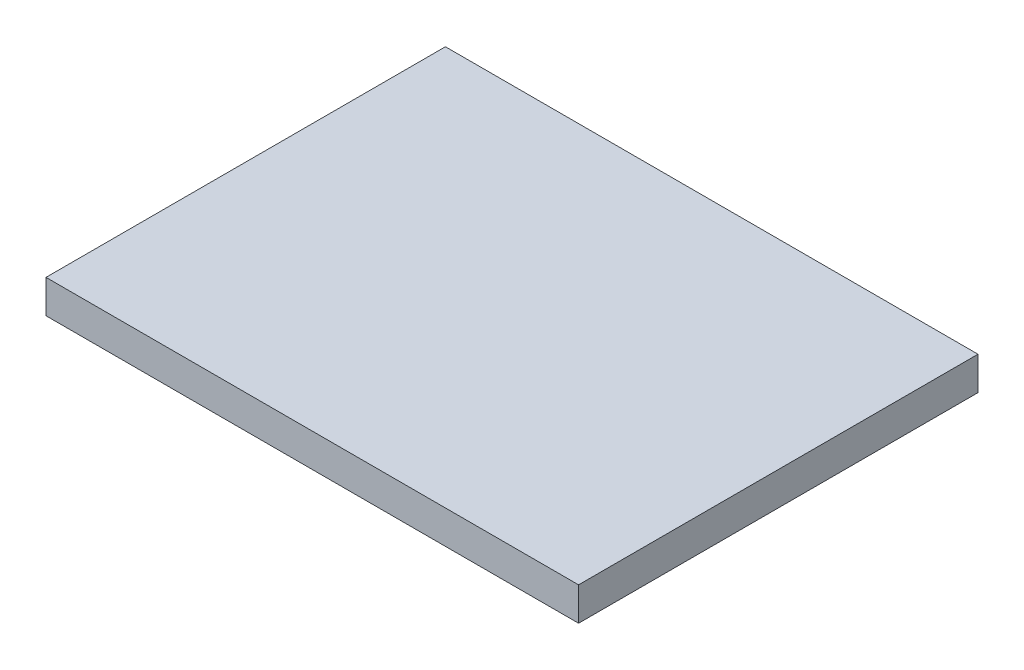
ISO-10303-21;
HEADER;
FILE_DESCRIPTION(('STEP AP214'),'2;1');
FILE_NAME('part.step','',(''),(''),'','','');
FILE_SCHEMA(('AUTOMOTIVE_DESIGN { 1 0 10303 214 1 1 1 1 }'));
ENDSEC;
DATA;
#1=APPLICATION_CONTEXT('core data for automotive mechanical design processes');
#2=APPLICATION_PROTOCOL_DEFINITION('international standard','automotive_design',2000,#1);
#3=PRODUCT_CONTEXT('',#1,'mechanical');
#4=PRODUCT('Part','Part','',(#3));
#5=PRODUCT_RELATED_PRODUCT_CATEGORY('part','',(#4));
#6=PRODUCT_DEFINITION_FORMATION('','',#4);
#7=PRODUCT_DEFINITION_CONTEXT('part definition',#1,'design');
#8=PRODUCT_DEFINITION('design','',#6,#7);
#9=PRODUCT_DEFINITION_SHAPE('','',#8);
#10=(LENGTH_UNIT() NAMED_UNIT(*) SI_UNIT(.MILLI.,.METRE.));
#11=(NAMED_UNIT(*) PLANE_ANGLE_UNIT() SI_UNIT($,.RADIAN.));
#12=(NAMED_UNIT(*) SI_UNIT($,.STERADIAN.) SOLID_ANGLE_UNIT());
#13=UNCERTAINTY_MEASURE_WITH_UNIT(LENGTH_MEASURE(1.E-05),#10,'distance_accuracy_value','');
#14=(GEOMETRIC_REPRESENTATION_CONTEXT(3) GLOBAL_UNCERTAINTY_ASSIGNED_CONTEXT((#13)) GLOBAL_UNIT_ASSIGNED_CONTEXT((#10,
#11,#12)) REPRESENTATION_CONTEXT('',''));
#15=CARTESIAN_POINT('',(0.,0.,0.));
#16=DIRECTION('',(0.,0.,1.));
#17=DIRECTION('',(1.,0.,0.));
#18=AXIS2_PLACEMENT_3D('',#15,#16,#17);
#19=CARTESIAN_POINT('',(0.,3.175,0.));
#20=DIRECTION('',(1.,0.,0.));
#21=DIRECTION('',(0.,0.,-1.));
#22=AXIS2_PLACEMENT_3D('',#19,#20,#21);
#23=PLANE('',#22);
#24=DIRECTION('',(0.,0.,1.));
#25=VECTOR('',#24,1.);
#26=CARTESIAN_POINT('',(0.,0.,0.));
#27=LINE('',#26,#25);
#28=CARTESIAN_POINT('',(0.,0.,-38.1));
#29=VERTEX_POINT('',#28);
#30=CARTESIAN_POINT('',(0.,0.,0.));
#31=VERTEX_POINT('',#30);
#32=EDGE_CURVE('E94',#29,#31,#27,.T.);
#33=ORIENTED_EDGE('',*,*,#32,.T.);
#34=DIRECTION('',(0.,-1.,0.));
#35=VECTOR('',#34,1.);
#36=CARTESIAN_POINT('',(0.,3.175,0.));
#37=LINE('',#36,#35);
#38=CARTESIAN_POINT('',(0.,3.175,0.));
#39=VERTEX_POINT('',#38);
#40=EDGE_CURVE('E11',#39,#31,#37,.T.);
#41=ORIENTED_EDGE('',*,*,#40,.F.);
#42=DIRECTION('',(0.,0.,1.));
#43=VECTOR('',#42,1.);
#44=CARTESIAN_POINT('',(0.,3.175,0.));
#45=LINE('',#44,#43);
#46=CARTESIAN_POINT('',(0.,3.175,-38.1));
#47=VERTEX_POINT('',#46);
#48=EDGE_CURVE('E82',#47,#39,#45,.T.);
#49=ORIENTED_EDGE('',*,*,#48,.F.);
#50=DIRECTION('',(0.,-1.,0.));
#51=VECTOR('',#50,1.);
#52=CARTESIAN_POINT('',(0.,3.175,-38.1));
#53=LINE('',#52,#51);
#54=EDGE_CURVE('E90',#47,#29,#53,.T.);
#55=ORIENTED_EDGE('',*,*,#54,.T.);
#56=EDGE_LOOP('',(#33,#41,#49,#55));
#57=FACE_BOUND('',#56,.T.);
#58=ADVANCED_FACE('F31',(#57),#23,.F.);
#59=CARTESIAN_POINT('',(0.,3.175,0.));
#60=DIRECTION('',(0.,0.,-1.));
#61=DIRECTION('',(-1.,0.,0.));
#62=AXIS2_PLACEMENT_3D('',#59,#60,#61);
#63=PLANE('',#62);
#64=DIRECTION('',(1.,0.,0.));
#65=VECTOR('',#64,1.);
#66=CARTESIAN_POINT('',(0.,0.,0.));
#67=LINE('',#66,#65);
#68=CARTESIAN_POINT('',(50.8,0.,0.));
#69=VERTEX_POINT('',#68);
#70=EDGE_CURVE('E86',#31,#69,#67,.T.);
#71=ORIENTED_EDGE('',*,*,#70,.T.);
#72=DIRECTION('',(0.,-1.,0.));
#73=VECTOR('',#72,1.);
#74=CARTESIAN_POINT('',(50.8,3.175,0.));
#75=LINE('',#74,#73);
#76=CARTESIAN_POINT('',(50.8,3.175,0.));
#77=VERTEX_POINT('',#76);
#78=EDGE_CURVE('E39',#77,#69,#75,.T.);
#79=ORIENTED_EDGE('',*,*,#78,.F.);
#80=DIRECTION('',(1.,0.,0.));
#81=VECTOR('',#80,1.);
#82=CARTESIAN_POINT('',(0.,3.175,0.));
#83=LINE('',#82,#81);
#84=EDGE_CURVE('E77',#39,#77,#83,.T.);
#85=ORIENTED_EDGE('',*,*,#84,.F.);
#86=ORIENTED_EDGE('',*,*,#40,.T.);
#87=EDGE_LOOP('',(#71,#79,#85,#86));
#88=FACE_BOUND('',#87,.T.);
#89=ADVANCED_FACE('F85',(#88),#63,.F.);
#90=CARTESIAN_POINT('',(50.8,3.175,0.));
#91=DIRECTION('',(-1.,0.,0.));
#92=DIRECTION('',(0.,0.,1.));
#93=AXIS2_PLACEMENT_3D('',#90,#91,#92);
#94=PLANE('',#93);
#95=DIRECTION('',(0.,0.,-1.));
#96=VECTOR('',#95,1.);
#97=CARTESIAN_POINT('',(50.8,0.,0.));
#98=LINE('',#97,#96);
#99=CARTESIAN_POINT('',(50.8,0.,-38.1));
#100=VERTEX_POINT('',#99);
#101=EDGE_CURVE('E64',#69,#100,#98,.T.);
#102=ORIENTED_EDGE('',*,*,#101,.T.);
#103=DIRECTION('',(0.,-1.,0.));
#104=VECTOR('',#103,1.);
#105=CARTESIAN_POINT('',(50.8,3.175,-38.1));
#106=LINE('',#105,#104);
#107=CARTESIAN_POINT('',(50.8,3.175,-38.1));
#108=VERTEX_POINT('',#107);
#109=EDGE_CURVE('E87',#108,#100,#106,.T.);
#110=ORIENTED_EDGE('',*,*,#109,.F.);
#111=DIRECTION('',(0.,0.,-1.));
#112=VECTOR('',#111,1.);
#113=CARTESIAN_POINT('',(50.8,3.175,0.));
#114=LINE('',#113,#112);
#115=EDGE_CURVE('E80',#77,#108,#114,.T.);
#116=ORIENTED_EDGE('',*,*,#115,.F.);
#117=ORIENTED_EDGE('',*,*,#78,.T.);
#118=EDGE_LOOP('',(#102,#110,#116,#117));
#119=FACE_BOUND('',#118,.T.);
#120=ADVANCED_FACE('F88',(#119),#94,.F.);
#121=CARTESIAN_POINT('',(0.,3.175,-38.1));
#122=DIRECTION('',(0.,0.,1.));
#123=DIRECTION('',(1.,0.,0.));
#124=AXIS2_PLACEMENT_3D('',#121,#122,#123);
#125=PLANE('',#124);
#126=DIRECTION('',(-1.,0.,0.));
#127=VECTOR('',#126,1.);
#128=CARTESIAN_POINT('',(0.,0.,-38.1));
#129=LINE('',#128,#127);
#130=EDGE_CURVE('E70',#100,#29,#129,.T.);
#131=ORIENTED_EDGE('',*,*,#130,.T.);
#132=ORIENTED_EDGE('',*,*,#54,.F.);
#133=DIRECTION('',(-1.,0.,0.));
#134=VECTOR('',#133,1.);
#135=CARTESIAN_POINT('',(0.,3.175,-38.1));
#136=LINE('',#135,#134);
#137=EDGE_CURVE('E47',#108,#47,#136,.T.);
#138=ORIENTED_EDGE('',*,*,#137,.F.);
#139=ORIENTED_EDGE('',*,*,#109,.T.);
#140=EDGE_LOOP('',(#131,#132,#138,#139));
#141=FACE_BOUND('',#140,.T.);
#142=ADVANCED_FACE('F101',(#141),#125,.F.);
#143=CARTESIAN_POINT('',(0.,3.175,-38.1));
#144=DIRECTION('',(0.,-1.,0.));
#145=DIRECTION('',(0.,0.,-1.));
#146=AXIS2_PLACEMENT_3D('',#143,#144,#145);
#147=PLANE('',#146);
#148=ORIENTED_EDGE('',*,*,#48,.T.);
#149=ORIENTED_EDGE('',*,*,#84,.T.);
#150=ORIENTED_EDGE('',*,*,#115,.T.);
#151=ORIENTED_EDGE('',*,*,#137,.T.);
#152=EDGE_LOOP('',(#148,#149,#150,#151));
#153=FACE_BOUND('',#152,.T.);
#154=ADVANCED_FACE('F78',(#153),#147,.F.);
#155=CARTESIAN_POINT('',(0.,0.,-38.1));
#156=DIRECTION('',(0.,-1.,0.));
#157=DIRECTION('',(0.,0.,-1.));
#158=AXIS2_PLACEMENT_3D('',#155,#156,#157);
#159=PLANE('',#158);
#160=ORIENTED_EDGE('',*,*,#32,.F.);
#161=ORIENTED_EDGE('',*,*,#130,.F.);
#162=ORIENTED_EDGE('',*,*,#101,.F.);
#163=ORIENTED_EDGE('',*,*,#70,.F.);
#164=EDGE_LOOP('',(#160,#161,#162,#163));
#165=FACE_BOUND('',#164,.T.);
#166=ADVANCED_FACE('F104',(#165),#159,.T.);
#167=CLOSED_SHELL('',(#58,#89,#120,#142,#154,#166));
#168=MANIFOLD_SOLID_BREP('B2',#167);
#169=ADVANCED_BREP_SHAPE_REPRESENTATION('',(#18,#168),#14);
#170=SHAPE_DEFINITION_REPRESENTATION(#9,#169);
ENDSEC;
END-ISO-10303-21;
